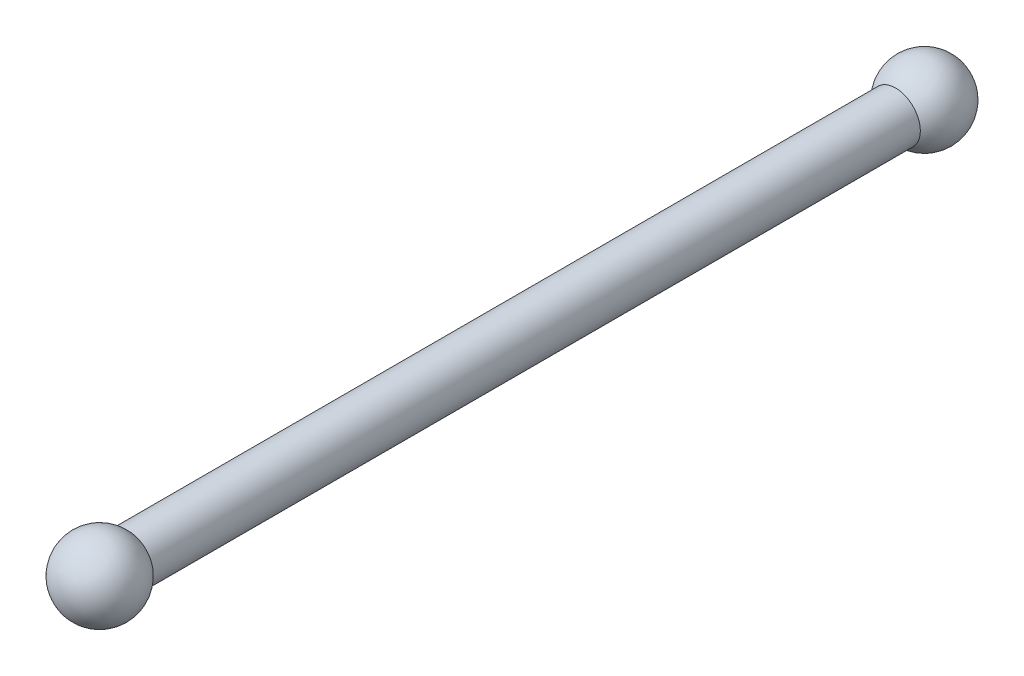
ISO-10303-21;
HEADER;
FILE_DESCRIPTION(('STEP AP214'),'2;1');
FILE_NAME('part.step','',(''),(''),'','','');
FILE_SCHEMA(('AUTOMOTIVE_DESIGN { 1 0 10303 214 1 1 1 1 }'));
ENDSEC;
DATA;
#1=APPLICATION_CONTEXT('core data for automotive mechanical design processes');
#2=APPLICATION_PROTOCOL_DEFINITION('international standard','automotive_design',2000,#1);
#3=PRODUCT_CONTEXT('',#1,'mechanical');
#4=PRODUCT('Part','Part','',(#3));
#5=PRODUCT_RELATED_PRODUCT_CATEGORY('part','',(#4));
#6=PRODUCT_DEFINITION_FORMATION('','',#4);
#7=PRODUCT_DEFINITION_CONTEXT('part definition',#1,'design');
#8=PRODUCT_DEFINITION('design','',#6,#7);
#9=PRODUCT_DEFINITION_SHAPE('','',#8);
#10=(LENGTH_UNIT() NAMED_UNIT(*) SI_UNIT(.MILLI.,.METRE.));
#11=(NAMED_UNIT(*) PLANE_ANGLE_UNIT() SI_UNIT($,.RADIAN.));
#12=(NAMED_UNIT(*) SI_UNIT($,.STERADIAN.) SOLID_ANGLE_UNIT());
#13=UNCERTAINTY_MEASURE_WITH_UNIT(LENGTH_MEASURE(1.E-05),#10,'distance_accuracy_value','');
#14=(GEOMETRIC_REPRESENTATION_CONTEXT(3) GLOBAL_UNCERTAINTY_ASSIGNED_CONTEXT((#13)) GLOBAL_UNIT_ASSIGNED_CONTEXT((#10,
#11,#12)) REPRESENTATION_CONTEXT('',''));
#15=CARTESIAN_POINT('',(0.,0.,0.));
#16=DIRECTION('',(0.,0.,1.));
#17=DIRECTION('',(1.,0.,0.));
#18=AXIS2_PLACEMENT_3D('',#15,#16,#17);
#19=CARTESIAN_POINT('',(0.,0.,0.));
#20=DIRECTION('',(0.,0.,1.));
#21=DIRECTION('',(1.,0.,0.));
#22=AXIS2_PLACEMENT_3D('',#19,#20,#21);
#23=SPHERICAL_SURFACE('',#22,292.1);
#24=CARTESIAN_POINT('',(0.,0.,221.432066331866));
#25=DIRECTION('',(0.,0.,1.));
#26=DIRECTION('',(1.,0.,0.));
#27=AXIS2_PLACEMENT_3D('',#24,#25,#26);
#28=CIRCLE('',#27,190.5);
#29=CARTESIAN_POINT('',(190.5,0.,221.432066331866));
#30=VERTEX_POINT('',#29);
#31=EDGE_CURVE('E40',#30,#30,#28,.T.);
#32=ORIENTED_EDGE('',*,*,#31,.F.);
#33=EDGE_LOOP('',(#32));
#34=FACE_BOUND('',#33,.T.);
#35=ADVANCED_FACE('F34',(#34),#23,.T.);
#36=CARTESIAN_POINT('',(0.,0.,6350.));
#37=DIRECTION('',(0.,0.,1.));
#38=DIRECTION('',(-1.,0.,0.));
#39=AXIS2_PLACEMENT_3D('',#36,#37,#38);
#40=SPHERICAL_SURFACE('',#39,292.1);
#41=CARTESIAN_POINT('',(0.,0.,6128.56793366813));
#42=DIRECTION('',(0.,0.,1.));
#43=DIRECTION('',(1.,0.,0.));
#44=AXIS2_PLACEMENT_3D('',#41,#42,#43);
#45=CIRCLE('',#44,190.499999999999);
#46=CARTESIAN_POINT('',(190.499999999999,0.,6128.56793366813));
#47=VERTEX_POINT('',#46);
#48=EDGE_CURVE('E10',#47,#47,#45,.T.);
#49=ORIENTED_EDGE('',*,*,#48,.T.);
#50=EDGE_LOOP('',(#49));
#51=FACE_BOUND('',#50,.T.);
#52=ADVANCED_FACE('F50',(#51),#40,.T.);
#53=CARTESIAN_POINT('',(0.,0.,-292.1));
#54=DIRECTION('',(0.,0.,1.));
#55=DIRECTION('',(1.,0.,0.));
#56=AXIS2_PLACEMENT_3D('',#53,#54,#55);
#57=CYLINDRICAL_SURFACE('',#56,190.499999999999);
#58=ORIENTED_EDGE('',*,*,#31,.T.);
#59=EDGE_LOOP('',(#58));
#60=FACE_BOUND('',#59,.T.);
#61=ORIENTED_EDGE('',*,*,#48,.F.);
#62=EDGE_LOOP('',(#61));
#63=FACE_BOUND('',#62,.T.);
#64=ADVANCED_FACE('F46',(#60,#63),#57,.T.);
#65=CLOSED_SHELL('',(#35,#52,#64));
#66=MANIFOLD_SOLID_BREP('B2',#65);
#67=ADVANCED_BREP_SHAPE_REPRESENTATION('',(#18,#66),#14);
#68=SHAPE_DEFINITION_REPRESENTATION(#9,#67);
ENDSEC;
END-ISO-10303-21;
